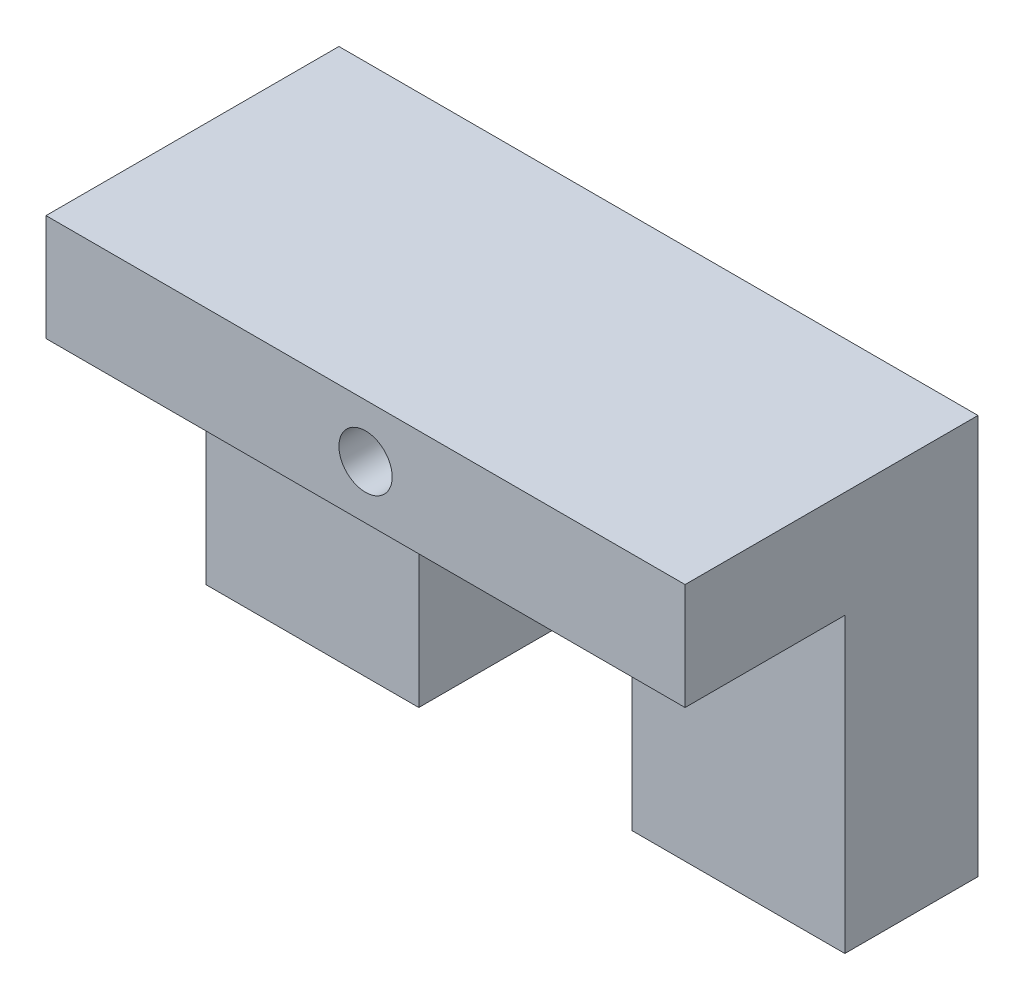
ISO-10303-21;
HEADER;
FILE_DESCRIPTION(('STEP AP214'),'2;1');
FILE_NAME('part.step','',(''),(''),'','','');
FILE_SCHEMA(('AUTOMOTIVE_DESIGN { 1 0 10303 214 1 1 1 1 }'));
ENDSEC;
DATA;
#1=APPLICATION_CONTEXT('core data for automotive mechanical design processes');
#2=APPLICATION_PROTOCOL_DEFINITION('international standard','automotive_design',2000,#1);
#3=PRODUCT_CONTEXT('',#1,'mechanical');
#4=PRODUCT('Part','Part','',(#3));
#5=PRODUCT_RELATED_PRODUCT_CATEGORY('part','',(#4));
#6=PRODUCT_DEFINITION_FORMATION('','',#4);
#7=PRODUCT_DEFINITION_CONTEXT('part definition',#1,'design');
#8=PRODUCT_DEFINITION('design','',#6,#7);
#9=PRODUCT_DEFINITION_SHAPE('','',#8);
#10=(LENGTH_UNIT() NAMED_UNIT(*) SI_UNIT(.MILLI.,.METRE.));
#11=(NAMED_UNIT(*) PLANE_ANGLE_UNIT() SI_UNIT($,.RADIAN.));
#12=(NAMED_UNIT(*) SI_UNIT($,.STERADIAN.) SOLID_ANGLE_UNIT());
#13=UNCERTAINTY_MEASURE_WITH_UNIT(LENGTH_MEASURE(1.E-05),#10,'distance_accuracy_value','');
#14=(GEOMETRIC_REPRESENTATION_CONTEXT(3) GLOBAL_UNCERTAINTY_ASSIGNED_CONTEXT((#13)) GLOBAL_UNIT_ASSIGNED_CONTEXT((#10,
#11,#12)) REPRESENTATION_CONTEXT('',''));
#15=CARTESIAN_POINT('',(0.,0.,0.));
#16=DIRECTION('',(0.,0.,1.));
#17=DIRECTION('',(1.,0.,0.));
#18=AXIS2_PLACEMENT_3D('',#15,#16,#17);
#19=CARTESIAN_POINT('',(0.,0.,25.));
#20=DIRECTION('',(0.,0.,1.));
#21=DIRECTION('',(1.,0.,0.));
#22=AXIS2_PLACEMENT_3D('',#19,#20,#21);
#23=PLANE('',#22);
#24=DIRECTION('',(-1.,0.,0.));
#25=VECTOR('',#24,1.);
#26=CARTESIAN_POINT('',(40.,-45.,25.));
#27=LINE('',#26,#25);
#28=CARTESIAN_POINT('',(55.,-45.,25.));
#29=VERTEX_POINT('',#28);
#30=CARTESIAN_POINT('',(40.,-45.,25.));
#31=VERTEX_POINT('',#30);
#32=EDGE_CURVE('E139',#29,#31,#27,.T.);
#33=ORIENTED_EDGE('',*,*,#32,.F.);
#34=DIRECTION('',(0.,1.,0.));
#35=VECTOR('',#34,1.);
#36=CARTESIAN_POINT('',(55.,-45.,25.));
#37=LINE('',#36,#35);
#38=CARTESIAN_POINT('',(55.,-20.,25.));
#39=VERTEX_POINT('',#38);
#40=EDGE_CURVE('E131',#29,#39,#37,.T.);
#41=ORIENTED_EDGE('',*,*,#40,.T.);
#42=DIRECTION('',(1.,0.,0.));
#43=VECTOR('',#42,1.);
#44=CARTESIAN_POINT('',(0.,-20.,25.));
#45=LINE('',#44,#43);
#46=CARTESIAN_POINT('',(0.,-20.,25.));
#47=VERTEX_POINT('',#46);
#48=EDGE_CURVE('E56',#47,#39,#45,.T.);
#49=ORIENTED_EDGE('',*,*,#48,.F.);
#50=DIRECTION('',(0.,-1.,0.));
#51=VECTOR('',#50,1.);
#52=CARTESIAN_POINT('',(0.,0.,25.));
#53=LINE('',#52,#51);
#54=CARTESIAN_POINT('',(0.,-75.,25.));
#55=VERTEX_POINT('',#54);
#56=EDGE_CURVE('E187',#47,#55,#53,.T.);
#57=ORIENTED_EDGE('',*,*,#56,.T.);
#58=DIRECTION('',(1.,0.,0.));
#59=VECTOR('',#58,1.);
#60=CARTESIAN_POINT('',(0.,-75.,25.));
#61=LINE('',#60,#59);
#62=CARTESIAN_POINT('',(40.,-75.,25.));
#63=VERTEX_POINT('',#62);
#64=EDGE_CURVE('E191',#55,#63,#61,.T.);
#65=ORIENTED_EDGE('',*,*,#64,.T.);
#66=DIRECTION('',(0.,-1.,0.));
#67=VECTOR('',#66,1.);
#68=CARTESIAN_POINT('',(40.,-45.,25.));
#69=LINE('',#68,#67);
#70=EDGE_CURVE('E177',#31,#63,#69,.T.);
#71=ORIENTED_EDGE('',*,*,#70,.F.);
#72=EDGE_LOOP('',(#33,#41,#49,#57,#65,#71));
#73=FACE_BOUND('',#72,.T.);
#74=ADVANCED_FACE('F33',(#73),#23,.T.);
#75=CARTESIAN_POINT('',(0.,-20.,55.));
#76=DIRECTION('',(0.,1.,0.));
#77=DIRECTION('',(-1.,0.,0.));
#78=AXIS2_PLACEMENT_3D('',#75,#76,#77);
#79=PLANE('',#78);
#80=DIRECTION('',(0.,0.,1.));
#81=VECTOR('',#80,1.);
#82=CARTESIAN_POINT('',(55.,-20.,25.));
#83=LINE('',#82,#81);
#84=CARTESIAN_POINT('',(55.,-20.,55.));
#85=VERTEX_POINT('',#84);
#86=EDGE_CURVE('E129',#39,#85,#83,.T.);
#87=ORIENTED_EDGE('',*,*,#86,.T.);
#88=DIRECTION('',(1.,0.,0.));
#89=VECTOR('',#88,1.);
#90=CARTESIAN_POINT('',(0.,-20.,55.));
#91=LINE('',#90,#89);
#92=CARTESIAN_POINT('',(0.,-20.,55.));
#93=VERTEX_POINT('',#92);
#94=EDGE_CURVE('E236',#93,#85,#91,.T.);
#95=ORIENTED_EDGE('',*,*,#94,.F.);
#96=DIRECTION('',(0.,0.,-1.));
#97=VECTOR('',#96,1.);
#98=CARTESIAN_POINT('',(0.,-20.,55.));
#99=LINE('',#98,#97);
#100=EDGE_CURVE('E145',#93,#47,#99,.T.);
#101=ORIENTED_EDGE('',*,*,#100,.T.);
#102=ORIENTED_EDGE('',*,*,#48,.T.);
#103=EDGE_LOOP('',(#87,#95,#101,#102));
#104=FACE_BOUND('',#103,.T.);
#105=ADVANCED_FACE('F143',(#104),#79,.F.);
#106=CARTESIAN_POINT('',(0.,-75.,25.));
#107=DIRECTION('',(0.,1.,0.));
#108=DIRECTION('',(0.,0.,1.));
#109=AXIS2_PLACEMENT_3D('',#106,#107,#108);
#110=PLANE('',#109);
#111=DIRECTION('',(1.,0.,0.));
#112=VECTOR('',#111,1.);
#113=CARTESIAN_POINT('',(0.,-75.,0.));
#114=LINE('',#113,#112);
#115=CARTESIAN_POINT('',(0.,-75.,0.));
#116=VERTEX_POINT('',#115);
#117=CARTESIAN_POINT('',(40.,-75.,0.));
#118=VERTEX_POINT('',#117);
#119=EDGE_CURVE('E201',#116,#118,#114,.T.);
#120=ORIENTED_EDGE('',*,*,#119,.T.);
#121=DIRECTION('',(0.,0.,-1.));
#122=VECTOR('',#121,1.);
#123=CARTESIAN_POINT('',(40.,-75.,25.));
#124=LINE('',#123,#122);
#125=EDGE_CURVE('E161',#63,#118,#124,.T.);
#126=ORIENTED_EDGE('',*,*,#125,.F.);
#127=ORIENTED_EDGE('',*,*,#64,.F.);
#128=DIRECTION('',(0.,0.,-1.));
#129=VECTOR('',#128,1.);
#130=CARTESIAN_POINT('',(0.,-75.,25.));
#131=LINE('',#130,#129);
#132=EDGE_CURVE('E11',#55,#116,#131,.T.);
#133=ORIENTED_EDGE('',*,*,#132,.T.);
#134=EDGE_LOOP('',(#120,#126,#127,#133));
#135=FACE_BOUND('',#134,.T.);
#136=ADVANCED_FACE('F284',(#135),#110,.F.);
#137=CARTESIAN_POINT('',(0.,0.,25.));
#138=DIRECTION('',(1.,0.,0.));
#139=DIRECTION('',(0.,1.,0.));
#140=AXIS2_PLACEMENT_3D('',#137,#138,#139);
#141=PLANE('',#140);
#142=DIRECTION('',(0.,-1.,0.));
#143=VECTOR('',#142,1.);
#144=CARTESIAN_POINT('',(0.,0.,0.));
#145=LINE('',#144,#143);
#146=CARTESIAN_POINT('',(0.,0.,0.));
#147=VERTEX_POINT('',#146);
#148=EDGE_CURVE('E179',#147,#116,#145,.T.);
#149=ORIENTED_EDGE('',*,*,#148,.T.);
#150=ORIENTED_EDGE('',*,*,#132,.F.);
#151=ORIENTED_EDGE('',*,*,#56,.F.);
#152=ORIENTED_EDGE('',*,*,#100,.F.);
#153=DIRECTION('',(0.,-1.,0.));
#154=VECTOR('',#153,1.);
#155=CARTESIAN_POINT('',(0.,-20.,55.));
#156=LINE('',#155,#154);
#157=CARTESIAN_POINT('',(0.,0.,55.));
#158=VERTEX_POINT('',#157);
#159=EDGE_CURVE('E146',#158,#93,#156,.T.);
#160=ORIENTED_EDGE('',*,*,#159,.F.);
#161=DIRECTION('',(0.,0.,-1.));
#162=VECTOR('',#161,1.);
#163=CARTESIAN_POINT('',(0.,0.,25.));
#164=LINE('',#163,#162);
#165=EDGE_CURVE('E197',#158,#147,#164,.T.);
#166=ORIENTED_EDGE('',*,*,#165,.T.);
#167=EDGE_LOOP('',(#149,#150,#151,#152,#160,#166));
#168=FACE_BOUND('',#167,.T.);
#169=ADVANCED_FACE('F35',(#168),#141,.F.);
#170=CARTESIAN_POINT('',(80.,-75.,25.));
#171=VERTEX_POINT('',#170);
#172=CARTESIAN_POINT('',(120.,-75.,25.));
#173=VERTEX_POINT('',#172);
#174=EDGE_CURVE('E189',#171,#173,#61,.T.);
#175=ORIENTED_EDGE('',*,*,#174,.F.);
#176=DIRECTION('',(0.,0.,1.));
#177=VECTOR('',#176,1.);
#178=CARTESIAN_POINT('',(80.,-75.,25.));
#179=LINE('',#178,#177);
#180=CARTESIAN_POINT('',(80.,-75.,0.));
#181=VERTEX_POINT('',#180);
#182=EDGE_CURVE('E165',#181,#171,#179,.T.);
#183=ORIENTED_EDGE('',*,*,#182,.F.);
#184=CARTESIAN_POINT('',(120.,-75.,0.));
#185=VERTEX_POINT('',#184);
#186=EDGE_CURVE('E200',#181,#185,#114,.T.);
#187=ORIENTED_EDGE('',*,*,#186,.T.);
#188=DIRECTION('',(0.,0.,-1.));
#189=VECTOR('',#188,1.);
#190=CARTESIAN_POINT('',(120.,-75.,25.));
#191=LINE('',#190,#189);
#192=EDGE_CURVE('E41',#173,#185,#191,.T.);
#193=ORIENTED_EDGE('',*,*,#192,.F.);
#194=EDGE_LOOP('',(#175,#183,#187,#193));
#195=FACE_BOUND('',#194,.T.);
#196=ADVANCED_FACE('F304',(#195),#110,.F.);
#197=CARTESIAN_POINT('',(120.,0.,25.));
#198=DIRECTION('',(-1.,0.,0.));
#199=DIRECTION('',(0.,-1.,0.));
#200=AXIS2_PLACEMENT_3D('',#197,#198,#199);
#201=PLANE('',#200);
#202=DIRECTION('',(0.,1.,0.));
#203=VECTOR('',#202,1.);
#204=CARTESIAN_POINT('',(120.,0.,0.));
#205=LINE('',#204,#203);
#206=CARTESIAN_POINT('',(120.,0.,0.));
#207=VERTEX_POINT('',#206);
#208=EDGE_CURVE('E204',#185,#207,#205,.T.);
#209=ORIENTED_EDGE('',*,*,#208,.T.);
#210=DIRECTION('',(0.,0.,-1.));
#211=VECTOR('',#210,1.);
#212=CARTESIAN_POINT('',(120.,0.,25.));
#213=LINE('',#212,#211);
#214=CARTESIAN_POINT('',(120.,0.,55.));
#215=VERTEX_POINT('',#214);
#216=EDGE_CURVE('E209',#215,#207,#213,.T.);
#217=ORIENTED_EDGE('',*,*,#216,.F.);
#218=DIRECTION('',(0.,1.,0.));
#219=VECTOR('',#218,1.);
#220=CARTESIAN_POINT('',(120.,0.,55.));
#221=LINE('',#220,#219);
#222=CARTESIAN_POINT('',(120.,-20.,55.));
#223=VERTEX_POINT('',#222);
#224=EDGE_CURVE('E239',#223,#215,#221,.T.);
#225=ORIENTED_EDGE('',*,*,#224,.F.);
#226=DIRECTION('',(0.,0.,-1.));
#227=VECTOR('',#226,1.);
#228=CARTESIAN_POINT('',(120.,-20.,55.));
#229=LINE('',#228,#227);
#230=CARTESIAN_POINT('',(120.,-20.,25.));
#231=VERTEX_POINT('',#230);
#232=EDGE_CURVE('E157',#223,#231,#229,.T.);
#233=ORIENTED_EDGE('',*,*,#232,.T.);
#234=DIRECTION('',(0.,1.,0.));
#235=VECTOR('',#234,1.);
#236=CARTESIAN_POINT('',(120.,0.,25.));
#237=LINE('',#236,#235);
#238=EDGE_CURVE('E194',#173,#231,#237,.T.);
#239=ORIENTED_EDGE('',*,*,#238,.F.);
#240=ORIENTED_EDGE('',*,*,#192,.T.);
#241=EDGE_LOOP('',(#209,#217,#225,#233,#239,#240));
#242=FACE_BOUND('',#241,.T.);
#243=ADVANCED_FACE('F216',(#242),#201,.F.);
#244=CARTESIAN_POINT('',(0.,0.,25.));
#245=DIRECTION('',(0.,-1.,0.));
#246=DIRECTION('',(0.,0.,-1.));
#247=AXIS2_PLACEMENT_3D('',#244,#245,#246);
#248=PLANE('',#247);
#249=DIRECTION('',(-1.,0.,0.));
#250=VECTOR('',#249,1.);
#251=CARTESIAN_POINT('',(0.,0.,0.));
#252=LINE('',#251,#250);
#253=EDGE_CURVE('E190',#207,#147,#252,.T.);
#254=ORIENTED_EDGE('',*,*,#253,.T.);
#255=ORIENTED_EDGE('',*,*,#165,.F.);
#256=DIRECTION('',(-1.,0.,0.));
#257=VECTOR('',#256,1.);
#258=CARTESIAN_POINT('',(0.,0.,55.));
#259=LINE('',#258,#257);
#260=EDGE_CURVE('E155',#215,#158,#259,.T.);
#261=ORIENTED_EDGE('',*,*,#260,.F.);
#262=ORIENTED_EDGE('',*,*,#216,.T.);
#263=EDGE_LOOP('',(#254,#255,#261,#262));
#264=FACE_BOUND('',#263,.T.);
#265=ADVANCED_FACE('F227',(#264),#248,.F.);
#266=DIRECTION('',(0.,1.,0.));
#267=VECTOR('',#266,1.);
#268=CARTESIAN_POINT('',(65.,-45.,25.));
#269=LINE('',#268,#267);
#270=CARTESIAN_POINT('',(65.,-45.,25.));
#271=VERTEX_POINT('',#270);
#272=CARTESIAN_POINT('',(65.,-20.,25.));
#273=VERTEX_POINT('',#272);
#274=EDGE_CURVE('E248',#271,#273,#269,.T.);
#275=ORIENTED_EDGE('',*,*,#274,.F.);
#276=CARTESIAN_POINT('',(80.,-45.,25.));
#277=VERTEX_POINT('',#276);
#278=EDGE_CURVE('E171',#277,#271,#27,.T.);
#279=ORIENTED_EDGE('',*,*,#278,.F.);
#280=DIRECTION('',(0.,-1.,0.));
#281=VECTOR('',#280,1.);
#282=CARTESIAN_POINT('',(80.,-45.,25.));
#283=LINE('',#282,#281);
#284=EDGE_CURVE('E180',#277,#171,#283,.T.);
#285=ORIENTED_EDGE('',*,*,#284,.T.);
#286=ORIENTED_EDGE('',*,*,#174,.T.);
#287=ORIENTED_EDGE('',*,*,#238,.T.);
#288=EDGE_CURVE('E147',#273,#231,#45,.T.);
#289=ORIENTED_EDGE('',*,*,#288,.F.);
#290=EDGE_LOOP('',(#275,#279,#285,#286,#287,#289));
#291=FACE_BOUND('',#290,.T.);
#292=ADVANCED_FACE('F280',(#291),#23,.T.);
#293=CARTESIAN_POINT('',(0.,0.,0.));
#294=DIRECTION('',(0.,0.,1.));
#295=DIRECTION('',(1.,0.,0.));
#296=AXIS2_PLACEMENT_3D('',#293,#294,#295);
#297=PLANE('',#296);
#298=CARTESIAN_POINT('',(60.,-10.,0.));
#299=DIRECTION('',(0.,0.,1.));
#300=DIRECTION('',(1.,0.,0.));
#301=AXIS2_PLACEMENT_3D('',#298,#299,#300);
#302=CIRCLE('',#301,5.);
#303=CARTESIAN_POINT('',(65.,-10.,0.));
#304=VERTEX_POINT('',#303);
#305=EDGE_CURVE('E250',#304,#304,#302,.T.);
#306=ORIENTED_EDGE('',*,*,#305,.T.);
#307=EDGE_LOOP('',(#306));
#308=FACE_BOUND('',#307,.T.);
#309=DIRECTION('',(1.,0.,0.));
#310=VECTOR('',#309,1.);
#311=CARTESIAN_POINT('',(40.,-45.,0.));
#312=LINE('',#311,#310);
#313=CARTESIAN_POINT('',(40.,-45.,0.));
#314=VERTEX_POINT('',#313);
#315=CARTESIAN_POINT('',(80.,-45.,0.));
#316=VERTEX_POINT('',#315);
#317=EDGE_CURVE('E164',#314,#316,#312,.T.);
#318=ORIENTED_EDGE('',*,*,#317,.F.);
#319=DIRECTION('',(0.,-1.,0.));
#320=VECTOR('',#319,1.);
#321=CARTESIAN_POINT('',(40.,-45.,0.));
#322=LINE('',#321,#320);
#323=EDGE_CURVE('E174',#314,#118,#322,.T.);
#324=ORIENTED_EDGE('',*,*,#323,.T.);
#325=ORIENTED_EDGE('',*,*,#119,.F.);
#326=ORIENTED_EDGE('',*,*,#148,.F.);
#327=ORIENTED_EDGE('',*,*,#253,.F.);
#328=ORIENTED_EDGE('',*,*,#208,.F.);
#329=ORIENTED_EDGE('',*,*,#186,.F.);
#330=DIRECTION('',(0.,-1.,0.));
#331=VECTOR('',#330,1.);
#332=CARTESIAN_POINT('',(80.,-45.,0.));
#333=LINE('',#332,#331);
#334=EDGE_CURVE('E183',#316,#181,#333,.T.);
#335=ORIENTED_EDGE('',*,*,#334,.F.);
#336=EDGE_LOOP('',(#318,#324,#325,#326,#327,#328,#329,#335));
#337=FACE_BOUND('',#336,.T.);
#338=ADVANCED_FACE('F223',(#308,#337),#297,.F.);
#339=CARTESIAN_POINT('',(40.,-45.,25.));
#340=DIRECTION('',(-1.,0.,0.));
#341=DIRECTION('',(0.,0.,1.));
#342=AXIS2_PLACEMENT_3D('',#339,#340,#341);
#343=PLANE('',#342);
#344=ORIENTED_EDGE('',*,*,#125,.T.);
#345=ORIENTED_EDGE('',*,*,#323,.F.);
#346=DIRECTION('',(0.,0.,-1.));
#347=VECTOR('',#346,1.);
#348=CARTESIAN_POINT('',(40.,-45.,25.));
#349=LINE('',#348,#347);
#350=EDGE_CURVE('E162',#31,#314,#349,.T.);
#351=ORIENTED_EDGE('',*,*,#350,.F.);
#352=ORIENTED_EDGE('',*,*,#70,.T.);
#353=EDGE_LOOP('',(#344,#345,#351,#352));
#354=FACE_BOUND('',#353,.T.);
#355=ADVANCED_FACE('F293',(#354),#343,.F.);
#356=CARTESIAN_POINT('',(80.,-45.,25.));
#357=DIRECTION('',(1.,0.,0.));
#358=DIRECTION('',(0.,0.,-1.));
#359=AXIS2_PLACEMENT_3D('',#356,#357,#358);
#360=PLANE('',#359);
#361=ORIENTED_EDGE('',*,*,#182,.T.);
#362=ORIENTED_EDGE('',*,*,#284,.F.);
#363=DIRECTION('',(0.,0.,1.));
#364=VECTOR('',#363,1.);
#365=CARTESIAN_POINT('',(80.,-45.,25.));
#366=LINE('',#365,#364);
#367=EDGE_CURVE('E168',#316,#277,#366,.T.);
#368=ORIENTED_EDGE('',*,*,#367,.F.);
#369=ORIENTED_EDGE('',*,*,#334,.T.);
#370=EDGE_LOOP('',(#361,#362,#368,#369));
#371=FACE_BOUND('',#370,.T.);
#372=ADVANCED_FACE('F302',(#371),#360,.F.);
#373=CARTESIAN_POINT('',(0.,-45.,0.));
#374=DIRECTION('',(0.,-1.,0.));
#375=DIRECTION('',(0.,0.,-1.));
#376=AXIS2_PLACEMENT_3D('',#373,#374,#375);
#377=PLANE('',#376);
#378=ORIENTED_EDGE('',*,*,#350,.T.);
#379=ORIENTED_EDGE('',*,*,#317,.T.);
#380=ORIENTED_EDGE('',*,*,#367,.T.);
#381=ORIENTED_EDGE('',*,*,#278,.T.);
#382=DIRECTION('',(1.,0.,0.));
#383=VECTOR('',#382,1.);
#384=CARTESIAN_POINT('',(55.,-45.,25.));
#385=LINE('',#384,#383);
#386=EDGE_CURVE('E152',#29,#271,#385,.T.);
#387=ORIENTED_EDGE('',*,*,#386,.F.);
#388=ORIENTED_EDGE('',*,*,#32,.T.);
#389=EDGE_LOOP('',(#378,#379,#380,#381,#387,#388));
#390=FACE_BOUND('',#389,.T.);
#391=ADVANCED_FACE('F275',(#390),#377,.T.);
#392=CARTESIAN_POINT('',(65.,-20.,55.));
#393=VERTEX_POINT('',#392);
#394=EDGE_CURVE('E150',#393,#223,#91,.T.);
#395=ORIENTED_EDGE('',*,*,#394,.F.);
#396=DIRECTION('',(0.,0.,1.));
#397=VECTOR('',#396,1.);
#398=CARTESIAN_POINT('',(65.,-20.,25.));
#399=LINE('',#398,#397);
#400=EDGE_CURVE('E246',#273,#393,#399,.T.);
#401=ORIENTED_EDGE('',*,*,#400,.F.);
#402=ORIENTED_EDGE('',*,*,#288,.T.);
#403=ORIENTED_EDGE('',*,*,#232,.F.);
#404=EDGE_LOOP('',(#395,#401,#402,#403));
#405=FACE_BOUND('',#404,.T.);
#406=ADVANCED_FACE('F268',(#405),#79,.F.);
#407=CARTESIAN_POINT('',(0.,0.,55.));
#408=DIRECTION('',(0.,0.,-1.));
#409=DIRECTION('',(-1.,0.,0.));
#410=AXIS2_PLACEMENT_3D('',#407,#408,#409);
#411=PLANE('',#410);
#412=CARTESIAN_POINT('',(60.,-10.,55.));
#413=DIRECTION('',(0.,0.,1.));
#414=DIRECTION('',(1.,0.,0.));
#415=AXIS2_PLACEMENT_3D('',#412,#413,#414);
#416=CIRCLE('',#415,5.);
#417=CARTESIAN_POINT('',(65.,-10.,55.));
#418=VERTEX_POINT('',#417);
#419=EDGE_CURVE('E252',#418,#418,#416,.T.);
#420=ORIENTED_EDGE('',*,*,#419,.F.);
#421=EDGE_LOOP('',(#420));
#422=FACE_BOUND('',#421,.T.);
#423=ORIENTED_EDGE('',*,*,#159,.T.);
#424=ORIENTED_EDGE('',*,*,#94,.T.);
#425=DIRECTION('',(1.,0.,0.));
#426=VECTOR('',#425,1.);
#427=CARTESIAN_POINT('',(55.,-20.,55.));
#428=LINE('',#427,#426);
#429=EDGE_CURVE('E242',#85,#393,#428,.T.);
#430=ORIENTED_EDGE('',*,*,#429,.T.);
#431=ORIENTED_EDGE('',*,*,#394,.T.);
#432=ORIENTED_EDGE('',*,*,#224,.T.);
#433=ORIENTED_EDGE('',*,*,#260,.T.);
#434=EDGE_LOOP('',(#423,#424,#430,#431,#432,#433));
#435=FACE_BOUND('',#434,.T.);
#436=ADVANCED_FACE('F234',(#422,#435),#411,.F.);
#437=CARTESIAN_POINT('',(55.,-20.,55.));
#438=DIRECTION('',(0.,-0.768221279597376,0.64018439966448));
#439=DIRECTION('',(0.,-0.64018439966448,-0.768221279597376));
#440=AXIS2_PLACEMENT_3D('',#437,#438,#439);
#441=PLANE('',#440);
#442=DIRECTION('',(0.,-0.64018439966448,-0.768221279597376));
#443=VECTOR('',#442,1.);
#444=CARTESIAN_POINT('',(65.,-20.,55.));
#445=LINE('',#444,#443);
#446=EDGE_CURVE('E48',#393,#271,#445,.T.);
#447=ORIENTED_EDGE('',*,*,#446,.F.);
#448=ORIENTED_EDGE('',*,*,#429,.F.);
#449=DIRECTION('',(0.,-0.64018439966448,-0.768221279597376));
#450=VECTOR('',#449,1.);
#451=CARTESIAN_POINT('',(55.,-20.,55.));
#452=LINE('',#451,#450);
#453=EDGE_CURVE('E133',#85,#29,#452,.T.);
#454=ORIENTED_EDGE('',*,*,#453,.T.);
#455=ORIENTED_EDGE('',*,*,#386,.T.);
#456=EDGE_LOOP('',(#447,#448,#454,#455));
#457=FACE_BOUND('',#456,.T.);
#458=ADVANCED_FACE('F267',(#457),#441,.T.);
#459=CARTESIAN_POINT('',(55.,0.,0.));
#460=DIRECTION('',(1.,0.,0.));
#461=DIRECTION('',(0.,1.,0.));
#462=AXIS2_PLACEMENT_3D('',#459,#460,#461);
#463=PLANE('',#462);
#464=ORIENTED_EDGE('',*,*,#40,.F.);
#465=ORIENTED_EDGE('',*,*,#453,.F.);
#466=ORIENTED_EDGE('',*,*,#86,.F.);
#467=EDGE_LOOP('',(#464,#465,#466));
#468=FACE_BOUND('',#467,.T.);
#469=ADVANCED_FACE('F130',(#468),#463,.F.);
#470=CARTESIAN_POINT('',(65.,0.,0.));
#471=DIRECTION('',(1.,0.,0.));
#472=DIRECTION('',(0.,1.,0.));
#473=AXIS2_PLACEMENT_3D('',#470,#471,#472);
#474=PLANE('',#473);
#475=ORIENTED_EDGE('',*,*,#274,.T.);
#476=ORIENTED_EDGE('',*,*,#400,.T.);
#477=ORIENTED_EDGE('',*,*,#446,.T.);
#478=EDGE_LOOP('',(#475,#476,#477));
#479=FACE_BOUND('',#478,.T.);
#480=ADVANCED_FACE('F262',(#479),#474,.T.);
#481=CARTESIAN_POINT('',(60.,-10.,0.));
#482=DIRECTION('',(0.,0.,1.));
#483=DIRECTION('',(1.,0.,0.));
#484=AXIS2_PLACEMENT_3D('',#481,#482,#483);
#485=CYLINDRICAL_SURFACE('',#484,5.);
#486=ORIENTED_EDGE('',*,*,#305,.F.);
#487=EDGE_LOOP('',(#486));
#488=FACE_BOUND('',#487,.T.);
#489=ORIENTED_EDGE('',*,*,#419,.T.);
#490=EDGE_LOOP('',(#489));
#491=FACE_BOUND('',#490,.T.);
#492=ADVANCED_FACE('F259',(#488,#491),#485,.F.);
#493=CLOSED_SHELL('',(#74,#105,#136,#169,#196,#243,#265,#292,#338,#355,#372,#391,#406,#436,#458,
#469,#480,#492));
#494=MANIFOLD_SOLID_BREP('B2',#493);
#495=ADVANCED_BREP_SHAPE_REPRESENTATION('',(#18,#494),#14);
#496=SHAPE_DEFINITION_REPRESENTATION(#9,#495);
ENDSEC;
END-ISO-10303-21;
